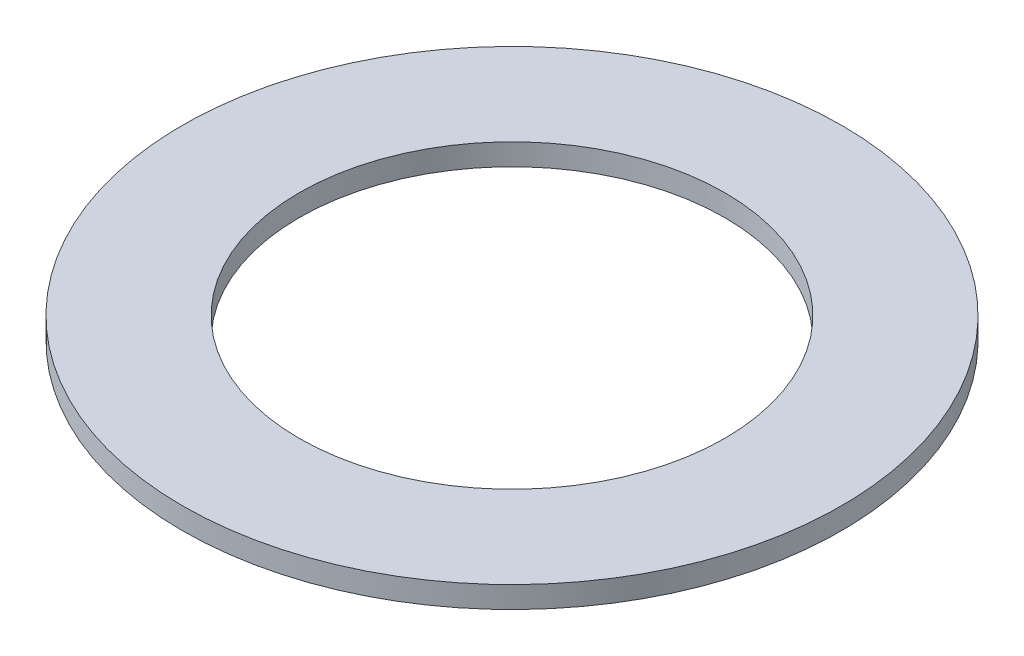
ISO-10303-21;
HEADER;
FILE_DESCRIPTION(('STEP AP214'),'2;1');
FILE_NAME('part.step','',(''),(''),'','','');
FILE_SCHEMA(('AUTOMOTIVE_DESIGN { 1 0 10303 214 1 1 1 1 }'));
ENDSEC;
DATA;
#1=APPLICATION_CONTEXT('core data for automotive mechanical design processes');
#2=APPLICATION_PROTOCOL_DEFINITION('international standard','automotive_design',2000,#1);
#3=PRODUCT_CONTEXT('',#1,'mechanical');
#4=PRODUCT('Part','Part','',(#3));
#5=PRODUCT_RELATED_PRODUCT_CATEGORY('part','',(#4));
#6=PRODUCT_DEFINITION_FORMATION('','',#4);
#7=PRODUCT_DEFINITION_CONTEXT('part definition',#1,'design');
#8=PRODUCT_DEFINITION('design','',#6,#7);
#9=PRODUCT_DEFINITION_SHAPE('','',#8);
#10=(LENGTH_UNIT() NAMED_UNIT(*) SI_UNIT(.MILLI.,.METRE.));
#11=(NAMED_UNIT(*) PLANE_ANGLE_UNIT() SI_UNIT($,.RADIAN.));
#12=(NAMED_UNIT(*) SI_UNIT($,.STERADIAN.) SOLID_ANGLE_UNIT());
#13=UNCERTAINTY_MEASURE_WITH_UNIT(LENGTH_MEASURE(1.E-05),#10,'distance_accuracy_value','');
#14=(GEOMETRIC_REPRESENTATION_CONTEXT(3) GLOBAL_UNCERTAINTY_ASSIGNED_CONTEXT((#13)) GLOBAL_UNIT_ASSIGNED_CONTEXT((#10,
#11,#12)) REPRESENTATION_CONTEXT('',''));
#15=CARTESIAN_POINT('',(0.,0.,0.));
#16=DIRECTION('',(0.,0.,1.));
#17=DIRECTION('',(1.,0.,0.));
#18=AXIS2_PLACEMENT_3D('',#15,#16,#17);
#19=CARTESIAN_POINT('',(0.,5.,0.));
#20=DIRECTION('',(0.,1.,0.));
#21=DIRECTION('',(0.,0.,1.));
#22=AXIS2_PLACEMENT_3D('',#19,#20,#21);
#23=PLANE('',#22);
#24=CARTESIAN_POINT('',(0.,5.,0.));
#25=DIRECTION('',(0.,1.,0.));
#26=DIRECTION('',(0.,0.,1.));
#27=AXIS2_PLACEMENT_3D('',#24,#25,#26);
#28=CIRCLE('',#27,76.2);
#29=CARTESIAN_POINT('',(0.,5.,76.2));
#30=VERTEX_POINT('',#29);
#31=EDGE_CURVE('E10',#30,#30,#28,.T.);
#32=ORIENTED_EDGE('',*,*,#31,.T.);
#33=EDGE_LOOP('',(#32));
#34=FACE_BOUND('',#33,.T.);
#35=CARTESIAN_POINT('',(0.,5.,0.));
#36=DIRECTION('',(0.,1.,0.));
#37=DIRECTION('',(0.,0.,1.));
#38=AXIS2_PLACEMENT_3D('',#35,#36,#37);
#39=CIRCLE('',#38,49.2);
#40=CARTESIAN_POINT('',(0.,5.,49.2));
#41=VERTEX_POINT('',#40);
#42=EDGE_CURVE('E42',#41,#41,#39,.T.);
#43=ORIENTED_EDGE('',*,*,#42,.F.);
#44=EDGE_LOOP('',(#43));
#45=FACE_BOUND('',#44,.T.);
#46=ADVANCED_FACE('F31',(#34,#45),#23,.T.);
#47=CARTESIAN_POINT('',(0.,0.,0.));
#48=DIRECTION('',(0.,1.,0.));
#49=DIRECTION('',(0.,0.,1.));
#50=AXIS2_PLACEMENT_3D('',#47,#48,#49);
#51=PLANE('',#50);
#52=CARTESIAN_POINT('',(0.,0.,0.));
#53=DIRECTION('',(0.,1.,0.));
#54=DIRECTION('',(0.,0.,1.));
#55=AXIS2_PLACEMENT_3D('',#52,#53,#54);
#56=CIRCLE('',#55,76.2);
#57=CARTESIAN_POINT('',(0.,0.,76.2));
#58=VERTEX_POINT('',#57);
#59=EDGE_CURVE('E35',#58,#58,#56,.T.);
#60=ORIENTED_EDGE('',*,*,#59,.F.);
#61=EDGE_LOOP('',(#60));
#62=FACE_BOUND('',#61,.T.);
#63=CARTESIAN_POINT('',(0.,0.,0.));
#64=DIRECTION('',(0.,1.,0.));
#65=DIRECTION('',(0.,0.,1.));
#66=AXIS2_PLACEMENT_3D('',#63,#64,#65);
#67=CIRCLE('',#66,49.2);
#68=CARTESIAN_POINT('',(0.,0.,49.2));
#69=VERTEX_POINT('',#68);
#70=EDGE_CURVE('E44',#69,#69,#67,.T.);
#71=ORIENTED_EDGE('',*,*,#70,.T.);
#72=EDGE_LOOP('',(#71));
#73=FACE_BOUND('',#72,.T.);
#74=ADVANCED_FACE('F54',(#62,#73),#51,.F.);
#75=CARTESIAN_POINT('',(0.,5.,0.));
#76=DIRECTION('',(0.,-1.,0.));
#77=DIRECTION('',(0.,0.,-1.));
#78=AXIS2_PLACEMENT_3D('',#75,#76,#77);
#79=CYLINDRICAL_SURFACE('',#78,76.2);
#80=ORIENTED_EDGE('',*,*,#31,.F.);
#81=EDGE_LOOP('',(#80));
#82=FACE_BOUND('',#81,.T.);
#83=ORIENTED_EDGE('',*,*,#59,.T.);
#84=EDGE_LOOP('',(#83));
#85=FACE_BOUND('',#84,.T.);
#86=ADVANCED_FACE('F33',(#82,#85),#79,.T.);
#87=CARTESIAN_POINT('',(0.,5.,0.));
#88=DIRECTION('',(0.,-1.,0.));
#89=DIRECTION('',(0.,0.,-1.));
#90=AXIS2_PLACEMENT_3D('',#87,#88,#89);
#91=CYLINDRICAL_SURFACE('',#90,49.2);
#92=ORIENTED_EDGE('',*,*,#42,.T.);
#93=EDGE_LOOP('',(#92));
#94=FACE_BOUND('',#93,.T.);
#95=ORIENTED_EDGE('',*,*,#70,.F.);
#96=EDGE_LOOP('',(#95));
#97=FACE_BOUND('',#96,.T.);
#98=ADVANCED_FACE('F50',(#94,#97),#91,.F.);
#99=CLOSED_SHELL('',(#46,#74,#86,#98));
#100=MANIFOLD_SOLID_BREP('B2',#99);
#101=ADVANCED_BREP_SHAPE_REPRESENTATION('',(#18,#100),#14);
#102=SHAPE_DEFINITION_REPRESENTATION(#9,#101);
ENDSEC;
END-ISO-10303-21;
